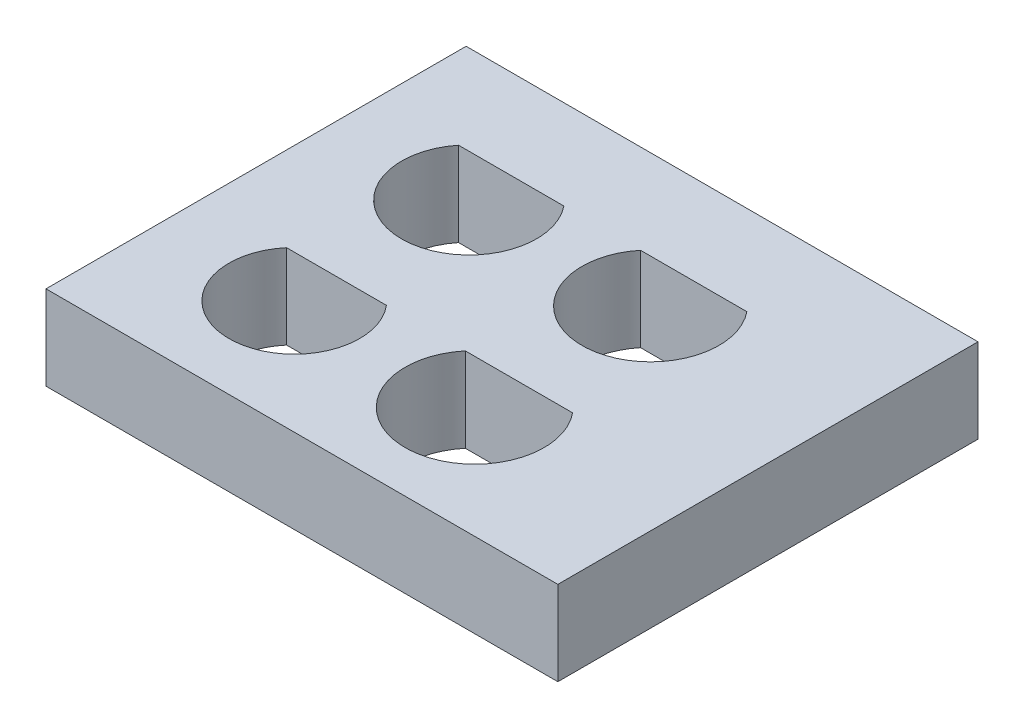
ISO-10303-21;
HEADER;
FILE_DESCRIPTION(('STEP AP214'),'2;1');
FILE_NAME('part.step','',(''),(''),'','','');
FILE_SCHEMA(('AUTOMOTIVE_DESIGN { 1 0 10303 214 1 1 1 1 }'));
ENDSEC;
DATA;
#1=APPLICATION_CONTEXT('core data for automotive mechanical design processes');
#2=APPLICATION_PROTOCOL_DEFINITION('international standard','automotive_design',2000,#1);
#3=PRODUCT_CONTEXT('',#1,'mechanical');
#4=PRODUCT('Part','Part','',(#3));
#5=PRODUCT_RELATED_PRODUCT_CATEGORY('part','',(#4));
#6=PRODUCT_DEFINITION_FORMATION('','',#4);
#7=PRODUCT_DEFINITION_CONTEXT('part definition',#1,'design');
#8=PRODUCT_DEFINITION('design','',#6,#7);
#9=PRODUCT_DEFINITION_SHAPE('','',#8);
#10=(LENGTH_UNIT() NAMED_UNIT(*) SI_UNIT(.MILLI.,.METRE.));
#11=(NAMED_UNIT(*) PLANE_ANGLE_UNIT() SI_UNIT($,.RADIAN.));
#12=(NAMED_UNIT(*) SI_UNIT($,.STERADIAN.) SOLID_ANGLE_UNIT());
#13=UNCERTAINTY_MEASURE_WITH_UNIT(LENGTH_MEASURE(1.E-05),#10,'distance_accuracy_value','');
#14=(GEOMETRIC_REPRESENTATION_CONTEXT(3) GLOBAL_UNCERTAINTY_ASSIGNED_CONTEXT((#13)) GLOBAL_UNIT_ASSIGNED_CONTEXT((#10,
#11,#12)) REPRESENTATION_CONTEXT('',''));
#15=CARTESIAN_POINT('',(0.,0.,0.));
#16=DIRECTION('',(0.,0.,1.));
#17=DIRECTION('',(1.,0.,0.));
#18=AXIS2_PLACEMENT_3D('',#15,#16,#17);
#19=CARTESIAN_POINT('',(-3.1906367996797,2.,2.69679574778097));
#20=DIRECTION('',(-1.,0.,0.));
#21=DIRECTION('',(0.,0.,1.));
#22=AXIS2_PLACEMENT_3D('',#19,#20,#21);
#23=PLANE('',#22);
#24=DIRECTION('',(0.,0.,-1.));
#25=VECTOR('',#24,1.);
#26=CARTESIAN_POINT('',(-3.1906367996797,0.,2.69679574778097));
#27=LINE('',#26,#25);
#28=CARTESIAN_POINT('',(-3.1906367996797,0.,2.69679574778097));
#29=VERTEX_POINT('',#28);
#30=CARTESIAN_POINT('',(-3.1906367996797,0.,-7.26485085857684));
#31=VERTEX_POINT('',#30);
#32=EDGE_CURVE('E256',#29,#31,#27,.T.);
#33=ORIENTED_EDGE('',*,*,#32,.F.);
#34=DIRECTION('',(0.,-1.,0.));
#35=VECTOR('',#34,1.);
#36=CARTESIAN_POINT('',(-3.1906367996797,2.,2.69679574778097));
#37=LINE('',#36,#35);
#38=CARTESIAN_POINT('',(-3.1906367996797,2.,2.69679574778097));
#39=VERTEX_POINT('',#38);
#40=EDGE_CURVE('E12',#39,#29,#37,.T.);
#41=ORIENTED_EDGE('',*,*,#40,.F.);
#42=DIRECTION('',(0.,0.,-1.));
#43=VECTOR('',#42,1.);
#44=CARTESIAN_POINT('',(-3.1906367996797,2.,2.69679574778097));
#45=LINE('',#44,#43);
#46=CARTESIAN_POINT('',(-3.1906367996797,2.,-7.26485085857684));
#47=VERTEX_POINT('',#46);
#48=EDGE_CURVE('E257',#39,#47,#45,.T.);
#49=ORIENTED_EDGE('',*,*,#48,.T.);
#50=DIRECTION('',(0.,-1.,0.));
#51=VECTOR('',#50,1.);
#52=CARTESIAN_POINT('',(-3.1906367996797,2.,-7.26485085857684));
#53=LINE('',#52,#51);
#54=EDGE_CURVE('E108',#47,#31,#53,.T.);
#55=ORIENTED_EDGE('',*,*,#54,.T.);
#56=EDGE_LOOP('',(#33,#41,#49,#55));
#57=FACE_BOUND('',#56,.T.);
#58=ADVANCED_FACE('F105',(#57),#23,.T.);
#59=CARTESIAN_POINT('',(-3.1906367996797,2.,2.69679574778097));
#60=DIRECTION('',(0.,0.,-1.));
#61=DIRECTION('',(-1.,0.,0.));
#62=AXIS2_PLACEMENT_3D('',#59,#60,#61);
#63=PLANE('',#62);
#64=DIRECTION('',(1.,0.,0.));
#65=VECTOR('',#64,1.);
#66=CARTESIAN_POINT('',(-3.1906367996797,0.,2.69679574778097));
#67=LINE('',#66,#65);
#68=CARTESIAN_POINT('',(8.94573547426326,0.,2.69679574778097));
#69=VERTEX_POINT('',#68);
#70=EDGE_CURVE('E261',#29,#69,#67,.T.);
#71=ORIENTED_EDGE('',*,*,#70,.T.);
#72=DIRECTION('',(0.,-1.,0.));
#73=VECTOR('',#72,1.);
#74=CARTESIAN_POINT('',(8.94573547426326,2.,2.69679574778097));
#75=LINE('',#74,#73);
#76=CARTESIAN_POINT('',(8.94573547426326,2.,2.69679574778097));
#77=VERTEX_POINT('',#76);
#78=EDGE_CURVE('E113',#77,#69,#75,.T.);
#79=ORIENTED_EDGE('',*,*,#78,.F.);
#80=DIRECTION('',(1.,0.,0.));
#81=VECTOR('',#80,1.);
#82=CARTESIAN_POINT('',(-3.1906367996797,2.,2.69679574778097));
#83=LINE('',#82,#81);
#84=EDGE_CURVE('E266',#39,#77,#83,.T.);
#85=ORIENTED_EDGE('',*,*,#84,.F.);
#86=ORIENTED_EDGE('',*,*,#40,.T.);
#87=EDGE_LOOP('',(#71,#79,#85,#86));
#88=FACE_BOUND('',#87,.T.);
#89=ADVANCED_FACE('F293',(#88),#63,.F.);
#90=CARTESIAN_POINT('',(8.94573547426326,2.,2.69679574778097));
#91=DIRECTION('',(-1.,0.,0.));
#92=DIRECTION('',(0.,0.,1.));
#93=AXIS2_PLACEMENT_3D('',#90,#91,#92);
#94=PLANE('',#93);
#95=DIRECTION('',(0.,0.,-1.));
#96=VECTOR('',#95,1.);
#97=CARTESIAN_POINT('',(8.94573547426326,0.,2.69679574778097));
#98=LINE('',#97,#96);
#99=CARTESIAN_POINT('',(8.94573547426326,0.,-7.26485085857684));
#100=VERTEX_POINT('',#99);
#101=EDGE_CURVE('E273',#69,#100,#98,.T.);
#102=ORIENTED_EDGE('',*,*,#101,.T.);
#103=DIRECTION('',(0.,-1.,0.));
#104=VECTOR('',#103,1.);
#105=CARTESIAN_POINT('',(8.94573547426326,2.,-7.26485085857684));
#106=LINE('',#105,#104);
#107=CARTESIAN_POINT('',(8.94573547426326,2.,-7.26485085857684));
#108=VERTEX_POINT('',#107);
#109=EDGE_CURVE('E278',#108,#100,#106,.T.);
#110=ORIENTED_EDGE('',*,*,#109,.F.);
#111=DIRECTION('',(0.,0.,-1.));
#112=VECTOR('',#111,1.);
#113=CARTESIAN_POINT('',(8.94573547426326,2.,2.69679574778097));
#114=LINE('',#113,#112);
#115=EDGE_CURVE('E264',#77,#108,#114,.T.);
#116=ORIENTED_EDGE('',*,*,#115,.F.);
#117=ORIENTED_EDGE('',*,*,#78,.T.);
#118=EDGE_LOOP('',(#102,#110,#116,#117));
#119=FACE_BOUND('',#118,.T.);
#120=ADVANCED_FACE('F297',(#119),#94,.F.);
#121=CARTESIAN_POINT('',(-3.1906367996797,2.,-7.26485085857684));
#122=DIRECTION('',(0.,0.,-1.));
#123=DIRECTION('',(-1.,0.,0.));
#124=AXIS2_PLACEMENT_3D('',#121,#122,#123);
#125=PLANE('',#124);
#126=DIRECTION('',(1.,0.,0.));
#127=VECTOR('',#126,1.);
#128=CARTESIAN_POINT('',(-3.1906367996797,0.,-7.26485085857684));
#129=LINE('',#128,#127);
#130=EDGE_CURVE('E270',#31,#100,#129,.T.);
#131=ORIENTED_EDGE('',*,*,#130,.F.);
#132=ORIENTED_EDGE('',*,*,#54,.F.);
#133=DIRECTION('',(1.,0.,0.));
#134=VECTOR('',#133,1.);
#135=CARTESIAN_POINT('',(-3.1906367996797,2.,-7.26485085857684));
#136=LINE('',#135,#134);
#137=EDGE_CURVE('E260',#47,#108,#136,.T.);
#138=ORIENTED_EDGE('',*,*,#137,.T.);
#139=ORIENTED_EDGE('',*,*,#109,.T.);
#140=EDGE_LOOP('',(#131,#132,#138,#139));
#141=FACE_BOUND('',#140,.T.);
#142=ADVANCED_FACE('F286',(#141),#125,.T.);
#143=CARTESIAN_POINT('',(0.,2.,0.));
#144=DIRECTION('',(0.,-1.,0.));
#145=DIRECTION('',(0.,0.,-1.));
#146=AXIS2_PLACEMENT_3D('',#143,#144,#145);
#147=PLANE('',#146);
#148=CARTESIAN_POINT('',(4.3262059758964,2.,0.0500000000000003));
#149=DIRECTION('',(0.,1.,0.));
#150=DIRECTION('',(0.,0.,1.));
#151=AXIS2_PLACEMENT_3D('',#148,#149,#150);
#152=CIRCLE('',#151,1.65);
#153=CARTESIAN_POINT('',(3.05341376976062,2.,-1.));
#154=VERTEX_POINT('',#153);
#155=CARTESIAN_POINT('',(5.59899818203219,2.,-1.));
#156=VERTEX_POINT('',#155);
#157=EDGE_CURVE('E193',#154,#156,#152,.T.);
#158=ORIENTED_EDGE('',*,*,#157,.F.);
#159=DIRECTION('',(1.,0.,0.));
#160=VECTOR('',#159,1.);
#161=CARTESIAN_POINT('',(0.,2.,-1.));
#162=LINE('',#161,#160);
#163=EDGE_CURVE('E121',#154,#156,#162,.T.);
#164=ORIENTED_EDGE('',*,*,#163,.T.);
#165=EDGE_LOOP('',(#158,#164));
#166=FACE_BOUND('',#165,.T.);
#167=CARTESIAN_POINT('',(0.,2.,0.));
#168=DIRECTION('',(0.,1.,0.));
#169=DIRECTION('',(0.,0.,1.));
#170=AXIS2_PLACEMENT_3D('',#167,#168,#169);
#171=CIRCLE('',#170,1.55);
#172=CARTESIAN_POINT('',(-1.1842719282327,2.,-1.));
#173=VERTEX_POINT('',#172);
#174=CARTESIAN_POINT('',(1.1842719282327,2.,-1.));
#175=VERTEX_POINT('',#174);
#176=EDGE_CURVE('E215',#173,#175,#171,.T.);
#177=ORIENTED_EDGE('',*,*,#176,.F.);
#178=DIRECTION('',(1.,0.,0.));
#179=VECTOR('',#178,1.);
#180=CARTESIAN_POINT('',(0.,2.,-1.));
#181=LINE('',#180,#179);
#182=EDGE_CURVE('E212',#173,#175,#181,.T.);
#183=ORIENTED_EDGE('',*,*,#182,.T.);
#184=EDGE_LOOP('',(#177,#183));
#185=FACE_BOUND('',#184,.T.);
#186=CARTESIAN_POINT('',(4.3262059758964,2.,-4.1181340855053));
#187=DIRECTION('',(0.,1.,0.));
#188=DIRECTION('',(0.,0.,1.));
#189=AXIS2_PLACEMENT_3D('',#186,#187,#188);
#190=CIRCLE('',#189,1.625);
#191=CARTESIAN_POINT('',(3.06525395460455,2.,-5.1431340855053));
#192=VERTEX_POINT('',#191);
#193=CARTESIAN_POINT('',(5.58715799718825,2.,-5.1431340855053));
#194=VERTEX_POINT('',#193);
#195=EDGE_CURVE('E230',#192,#194,#190,.T.);
#196=ORIENTED_EDGE('',*,*,#195,.F.);
#197=DIRECTION('',(1.,0.,0.));
#198=VECTOR('',#197,1.);
#199=CARTESIAN_POINT('',(0.,2.,-5.1431340855053));
#200=LINE('',#199,#198);
#201=EDGE_CURVE('E227',#192,#194,#200,.T.);
#202=ORIENTED_EDGE('',*,*,#201,.T.);
#203=EDGE_LOOP('',(#196,#202));
#204=FACE_BOUND('',#203,.T.);
#205=CARTESIAN_POINT('',(0.,2.,-4.1431340855053));
#206=DIRECTION('',(0.,1.,0.));
#207=DIRECTION('',(0.,0.,1.));
#208=AXIS2_PLACEMENT_3D('',#205,#206,#207);
#209=CIRCLE('',#208,1.6);
#210=CARTESIAN_POINT('',(-1.24899959967968,2.,-5.1431340855053));
#211=VERTEX_POINT('',#210);
#212=CARTESIAN_POINT('',(1.24899959967968,2.,-5.1431340855053));
#213=VERTEX_POINT('',#212);
#214=EDGE_CURVE('E245',#211,#213,#209,.T.);
#215=ORIENTED_EDGE('',*,*,#214,.F.);
#216=DIRECTION('',(1.,0.,0.));
#217=VECTOR('',#216,1.);
#218=CARTESIAN_POINT('',(0.,2.,-5.1431340855053));
#219=LINE('',#218,#217);
#220=EDGE_CURVE('E242',#211,#213,#219,.T.);
#221=ORIENTED_EDGE('',*,*,#220,.T.);
#222=EDGE_LOOP('',(#215,#221));
#223=FACE_BOUND('',#222,.T.);
#224=ORIENTED_EDGE('',*,*,#48,.F.);
#225=ORIENTED_EDGE('',*,*,#84,.T.);
#226=ORIENTED_EDGE('',*,*,#115,.T.);
#227=ORIENTED_EDGE('',*,*,#137,.F.);
#228=EDGE_LOOP('',(#224,#225,#226,#227));
#229=FACE_BOUND('',#228,.T.);
#230=ADVANCED_FACE('F203',(#166,#185,#204,#223,#229),#147,.F.);
#231=CARTESIAN_POINT('',(0.,0.,0.));
#232=DIRECTION('',(0.,-1.,0.));
#233=DIRECTION('',(0.,0.,-1.));
#234=AXIS2_PLACEMENT_3D('',#231,#232,#233);
#235=PLANE('',#234);
#236=DIRECTION('',(1.,0.,0.));
#237=VECTOR('',#236,1.);
#238=CARTESIAN_POINT('',(0.,0.,-1.));
#239=LINE('',#238,#237);
#240=CARTESIAN_POINT('',(3.05341376976062,0.,-1.));
#241=VERTEX_POINT('',#240);
#242=CARTESIAN_POINT('',(5.59899818203219,0.,-1.));
#243=VERTEX_POINT('',#242);
#244=EDGE_CURVE('E126',#241,#243,#239,.T.);
#245=ORIENTED_EDGE('',*,*,#244,.F.);
#246=CARTESIAN_POINT('',(4.3262059758964,0.,0.0500000000000003));
#247=DIRECTION('',(0.,1.,0.));
#248=DIRECTION('',(0.,0.,1.));
#249=AXIS2_PLACEMENT_3D('',#246,#247,#248);
#250=CIRCLE('',#249,1.65);
#251=EDGE_CURVE('E205',#241,#243,#250,.T.);
#252=ORIENTED_EDGE('',*,*,#251,.T.);
#253=EDGE_LOOP('',(#245,#252));
#254=FACE_BOUND('',#253,.T.);
#255=DIRECTION('',(1.,0.,0.));
#256=VECTOR('',#255,1.);
#257=CARTESIAN_POINT('',(0.,0.,-1.));
#258=LINE('',#257,#256);
#259=CARTESIAN_POINT('',(-1.1842719282327,0.,-1.));
#260=VERTEX_POINT('',#259);
#261=CARTESIAN_POINT('',(1.1842719282327,0.,-1.));
#262=VERTEX_POINT('',#261);
#263=EDGE_CURVE('E211',#260,#262,#258,.T.);
#264=ORIENTED_EDGE('',*,*,#263,.F.);
#265=CARTESIAN_POINT('',(0.,0.,0.));
#266=DIRECTION('',(0.,1.,0.));
#267=DIRECTION('',(0.,0.,1.));
#268=AXIS2_PLACEMENT_3D('',#265,#266,#267);
#269=CIRCLE('',#268,1.55);
#270=EDGE_CURVE('E216',#260,#262,#269,.T.);
#271=ORIENTED_EDGE('',*,*,#270,.T.);
#272=EDGE_LOOP('',(#264,#271));
#273=FACE_BOUND('',#272,.T.);
#274=DIRECTION('',(1.,0.,0.));
#275=VECTOR('',#274,1.);
#276=CARTESIAN_POINT('',(0.,0.,-5.1431340855053));
#277=LINE('',#276,#275);
#278=CARTESIAN_POINT('',(3.06525395460455,0.,-5.1431340855053));
#279=VERTEX_POINT('',#278);
#280=CARTESIAN_POINT('',(5.58715799718825,0.,-5.1431340855053));
#281=VERTEX_POINT('',#280);
#282=EDGE_CURVE('E226',#279,#281,#277,.T.);
#283=ORIENTED_EDGE('',*,*,#282,.F.);
#284=CARTESIAN_POINT('',(4.3262059758964,0.,-4.1181340855053));
#285=DIRECTION('',(0.,1.,0.));
#286=DIRECTION('',(0.,0.,1.));
#287=AXIS2_PLACEMENT_3D('',#284,#285,#286);
#288=CIRCLE('',#287,1.625);
#289=EDGE_CURVE('E231',#279,#281,#288,.T.);
#290=ORIENTED_EDGE('',*,*,#289,.T.);
#291=EDGE_LOOP('',(#283,#290));
#292=FACE_BOUND('',#291,.T.);
#293=DIRECTION('',(1.,0.,0.));
#294=VECTOR('',#293,1.);
#295=CARTESIAN_POINT('',(0.,0.,-5.1431340855053));
#296=LINE('',#295,#294);
#297=CARTESIAN_POINT('',(-1.24899959967968,0.,-5.1431340855053));
#298=VERTEX_POINT('',#297);
#299=CARTESIAN_POINT('',(1.24899959967968,0.,-5.1431340855053));
#300=VERTEX_POINT('',#299);
#301=EDGE_CURVE('E241',#298,#300,#296,.T.);
#302=ORIENTED_EDGE('',*,*,#301,.F.);
#303=CARTESIAN_POINT('',(0.,0.,-4.1431340855053));
#304=DIRECTION('',(0.,1.,0.));
#305=DIRECTION('',(0.,0.,1.));
#306=AXIS2_PLACEMENT_3D('',#303,#304,#305);
#307=CIRCLE('',#306,1.6);
#308=EDGE_CURVE('E246',#298,#300,#307,.T.);
#309=ORIENTED_EDGE('',*,*,#308,.T.);
#310=EDGE_LOOP('',(#302,#309));
#311=FACE_BOUND('',#310,.T.);
#312=ORIENTED_EDGE('',*,*,#32,.T.);
#313=ORIENTED_EDGE('',*,*,#130,.T.);
#314=ORIENTED_EDGE('',*,*,#101,.F.);
#315=ORIENTED_EDGE('',*,*,#70,.F.);
#316=EDGE_LOOP('',(#312,#313,#314,#315));
#317=FACE_BOUND('',#316,.T.);
#318=ADVANCED_FACE('F290',(#254,#273,#292,#311,#317),#235,.T.);
#319=CARTESIAN_POINT('',(0.,2.,-5.1431340855053));
#320=DIRECTION('',(0.,0.,-1.));
#321=DIRECTION('',(-1.,0.,0.));
#322=AXIS2_PLACEMENT_3D('',#319,#320,#321);
#323=PLANE('',#322);
#324=ORIENTED_EDGE('',*,*,#301,.T.);
#325=DIRECTION('',(0.,-1.,0.));
#326=VECTOR('',#325,1.);
#327=CARTESIAN_POINT('',(1.24899959967968,2.,-5.1431340855053));
#328=LINE('',#327,#326);
#329=EDGE_CURVE('E248',#213,#300,#328,.T.);
#330=ORIENTED_EDGE('',*,*,#329,.F.);
#331=ORIENTED_EDGE('',*,*,#220,.F.);
#332=DIRECTION('',(0.,-1.,0.));
#333=VECTOR('',#332,1.);
#334=CARTESIAN_POINT('',(-1.24899959967968,2.,-5.1431340855053));
#335=LINE('',#334,#333);
#336=EDGE_CURVE('E254',#211,#298,#335,.T.);
#337=ORIENTED_EDGE('',*,*,#336,.T.);
#338=EDGE_LOOP('',(#324,#330,#331,#337));
#339=FACE_BOUND('',#338,.T.);
#340=ADVANCED_FACE('F305',(#339),#323,.F.);
#341=CARTESIAN_POINT('',(0.,2.,-4.1431340855053));
#342=DIRECTION('',(0.,-1.,0.));
#343=DIRECTION('',(0.,0.,-1.));
#344=AXIS2_PLACEMENT_3D('',#341,#342,#343);
#345=CYLINDRICAL_SURFACE('',#344,1.6);
#346=ORIENTED_EDGE('',*,*,#308,.F.);
#347=ORIENTED_EDGE('',*,*,#336,.F.);
#348=ORIENTED_EDGE('',*,*,#214,.T.);
#349=ORIENTED_EDGE('',*,*,#329,.T.);
#350=EDGE_LOOP('',(#346,#347,#348,#349));
#351=FACE_BOUND('',#350,.T.);
#352=ADVANCED_FACE('F347',(#351),#345,.F.);
#353=CARTESIAN_POINT('',(0.,2.,-5.1431340855053));
#354=DIRECTION('',(0.,0.,-1.));
#355=DIRECTION('',(-1.,0.,0.));
#356=AXIS2_PLACEMENT_3D('',#353,#354,#355);
#357=PLANE('',#356);
#358=ORIENTED_EDGE('',*,*,#282,.T.);
#359=DIRECTION('',(0.,-1.,0.));
#360=VECTOR('',#359,1.);
#361=CARTESIAN_POINT('',(5.58715799718825,2.,-5.1431340855053));
#362=LINE('',#361,#360);
#363=EDGE_CURVE('E233',#194,#281,#362,.T.);
#364=ORIENTED_EDGE('',*,*,#363,.F.);
#365=ORIENTED_EDGE('',*,*,#201,.F.);
#366=DIRECTION('',(0.,-1.,0.));
#367=VECTOR('',#366,1.);
#368=CARTESIAN_POINT('',(3.06525395460455,2.,-5.1431340855053));
#369=LINE('',#368,#367);
#370=EDGE_CURVE('E239',#192,#279,#369,.T.);
#371=ORIENTED_EDGE('',*,*,#370,.T.);
#372=EDGE_LOOP('',(#358,#364,#365,#371));
#373=FACE_BOUND('',#372,.T.);
#374=ADVANCED_FACE('F356',(#373),#357,.F.);
#375=CARTESIAN_POINT('',(4.3262059758964,2.,-4.1181340855053));
#376=DIRECTION('',(0.,-1.,0.));
#377=DIRECTION('',(0.,0.,-1.));
#378=AXIS2_PLACEMENT_3D('',#375,#376,#377);
#379=CYLINDRICAL_SURFACE('',#378,1.625);
#380=ORIENTED_EDGE('',*,*,#289,.F.);
#381=ORIENTED_EDGE('',*,*,#370,.F.);
#382=ORIENTED_EDGE('',*,*,#195,.T.);
#383=ORIENTED_EDGE('',*,*,#363,.T.);
#384=EDGE_LOOP('',(#380,#381,#382,#383));
#385=FACE_BOUND('',#384,.T.);
#386=ADVANCED_FACE('F366',(#385),#379,.F.);
#387=CARTESIAN_POINT('',(0.,2.,-1.));
#388=DIRECTION('',(0.,0.,-1.));
#389=DIRECTION('',(-1.,0.,0.));
#390=AXIS2_PLACEMENT_3D('',#387,#388,#389);
#391=PLANE('',#390);
#392=ORIENTED_EDGE('',*,*,#263,.T.);
#393=DIRECTION('',(0.,-1.,0.));
#394=VECTOR('',#393,1.);
#395=CARTESIAN_POINT('',(1.1842719282327,2.,-1.));
#396=LINE('',#395,#394);
#397=EDGE_CURVE('E218',#175,#262,#396,.T.);
#398=ORIENTED_EDGE('',*,*,#397,.F.);
#399=ORIENTED_EDGE('',*,*,#182,.F.);
#400=DIRECTION('',(0.,-1.,0.));
#401=VECTOR('',#400,1.);
#402=CARTESIAN_POINT('',(-1.1842719282327,2.,-1.));
#403=LINE('',#402,#401);
#404=EDGE_CURVE('E224',#173,#260,#403,.T.);
#405=ORIENTED_EDGE('',*,*,#404,.T.);
#406=EDGE_LOOP('',(#392,#398,#399,#405));
#407=FACE_BOUND('',#406,.T.);
#408=ADVANCED_FACE('F376',(#407),#391,.F.);
#409=CARTESIAN_POINT('',(0.,2.,0.));
#410=DIRECTION('',(0.,-1.,0.));
#411=DIRECTION('',(0.,0.,-1.));
#412=AXIS2_PLACEMENT_3D('',#409,#410,#411);
#413=CYLINDRICAL_SURFACE('',#412,1.55);
#414=ORIENTED_EDGE('',*,*,#270,.F.);
#415=ORIENTED_EDGE('',*,*,#404,.F.);
#416=ORIENTED_EDGE('',*,*,#176,.T.);
#417=ORIENTED_EDGE('',*,*,#397,.T.);
#418=EDGE_LOOP('',(#414,#415,#416,#417));
#419=FACE_BOUND('',#418,.T.);
#420=ADVANCED_FACE('F386',(#419),#413,.F.);
#421=CARTESIAN_POINT('',(0.,2.,-1.));
#422=DIRECTION('',(0.,0.,-1.));
#423=DIRECTION('',(-1.,0.,0.));
#424=AXIS2_PLACEMENT_3D('',#421,#422,#423);
#425=PLANE('',#424);
#426=ORIENTED_EDGE('',*,*,#244,.T.);
#427=DIRECTION('',(0.,-1.,0.));
#428=VECTOR('',#427,1.);
#429=CARTESIAN_POINT('',(5.59899818203219,2.,-1.));
#430=LINE('',#429,#428);
#431=EDGE_CURVE('E196',#156,#243,#430,.T.);
#432=ORIENTED_EDGE('',*,*,#431,.F.);
#433=ORIENTED_EDGE('',*,*,#163,.F.);
#434=DIRECTION('',(0.,-1.,0.));
#435=VECTOR('',#434,1.);
#436=CARTESIAN_POINT('',(3.05341376976062,2.,-1.));
#437=LINE('',#436,#435);
#438=EDGE_CURVE('E198',#154,#241,#437,.T.);
#439=ORIENTED_EDGE('',*,*,#438,.T.);
#440=EDGE_LOOP('',(#426,#432,#433,#439));
#441=FACE_BOUND('',#440,.T.);
#442=ADVANCED_FACE('F201',(#441),#425,.F.);
#443=CARTESIAN_POINT('',(4.3262059758964,2.,0.0500000000000003));
#444=DIRECTION('',(0.,-1.,0.));
#445=DIRECTION('',(0.,0.,-1.));
#446=AXIS2_PLACEMENT_3D('',#443,#444,#445);
#447=CYLINDRICAL_SURFACE('',#446,1.65);
#448=ORIENTED_EDGE('',*,*,#251,.F.);
#449=ORIENTED_EDGE('',*,*,#438,.F.);
#450=ORIENTED_EDGE('',*,*,#157,.T.);
#451=ORIENTED_EDGE('',*,*,#431,.T.);
#452=EDGE_LOOP('',(#448,#449,#450,#451));
#453=FACE_BOUND('',#452,.T.);
#454=ADVANCED_FACE('F195',(#453),#447,.F.);
#455=CLOSED_SHELL('',(#58,#89,#120,#142,#230,#318,#340,#352,#374,#386,#408,#420,#442,#454));
#456=MANIFOLD_SOLID_BREP('B2',#455);
#457=ADVANCED_BREP_SHAPE_REPRESENTATION('',(#18,#456),#14);
#458=SHAPE_DEFINITION_REPRESENTATION(#9,#457);
ENDSEC;
END-ISO-10303-21;
